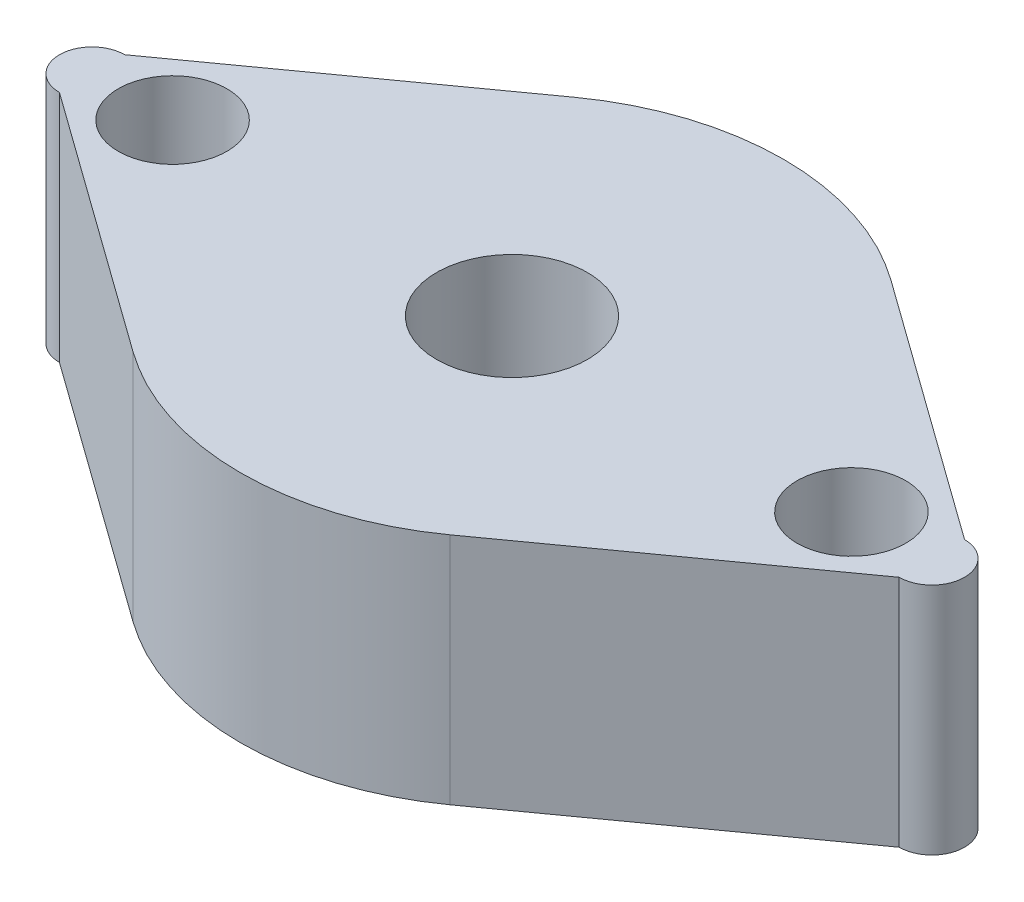
ISO-10303-21;
HEADER;
FILE_DESCRIPTION(('STEP AP214'),'2;1');
FILE_NAME('part.step','',(''),(''),'','','');
FILE_SCHEMA(('AUTOMOTIVE_DESIGN { 1 0 10303 214 1 1 1 1 }'));
ENDSEC;
DATA;
#1=APPLICATION_CONTEXT('core data for automotive mechanical design processes');
#2=APPLICATION_PROTOCOL_DEFINITION('international standard','automotive_design',2000,#1);
#3=PRODUCT_CONTEXT('',#1,'mechanical');
#4=PRODUCT('Part','Part','',(#3));
#5=PRODUCT_RELATED_PRODUCT_CATEGORY('part','',(#4));
#6=PRODUCT_DEFINITION_FORMATION('','',#4);
#7=PRODUCT_DEFINITION_CONTEXT('part definition',#1,'design');
#8=PRODUCT_DEFINITION('design','',#6,#7);
#9=PRODUCT_DEFINITION_SHAPE('','',#8);
#10=(LENGTH_UNIT() NAMED_UNIT(*) SI_UNIT(.MILLI.,.METRE.));
#11=(NAMED_UNIT(*) PLANE_ANGLE_UNIT() SI_UNIT($,.RADIAN.));
#12=(NAMED_UNIT(*) SI_UNIT($,.STERADIAN.) SOLID_ANGLE_UNIT());
#13=UNCERTAINTY_MEASURE_WITH_UNIT(LENGTH_MEASURE(1.E-05),#10,'distance_accuracy_value','');
#14=(GEOMETRIC_REPRESENTATION_CONTEXT(3) GLOBAL_UNCERTAINTY_ASSIGNED_CONTEXT((#13)) GLOBAL_UNIT_ASSIGNED_CONTEXT((#10,
#11,#12)) REPRESENTATION_CONTEXT('',''));
#15=CARTESIAN_POINT('',(0.,0.,0.));
#16=DIRECTION('',(0.,0.,1.));
#17=DIRECTION('',(1.,0.,0.));
#18=AXIS2_PLACEMENT_3D('',#15,#16,#17);
#19=CARTESIAN_POINT('',(27.8352326931538,15.5,0.));
#20=DIRECTION('',(0.,-1.,0.));
#21=DIRECTION('',(0.,0.,-1.));
#22=AXIS2_PLACEMENT_3D('',#19,#20,#21);
#23=CYLINDRICAL_SURFACE('',#22,2.16476730684618);
#24=CARTESIAN_POINT('',(27.8352326931538,0.,0.));
#25=DIRECTION('',(0.,1.,0.));
#26=DIRECTION('',(0.,0.,1.));
#27=AXIS2_PLACEMENT_3D('',#24,#25,#26);
#28=CIRCLE('',#27,2.16476730684618);
#29=CARTESIAN_POINT('',(27.8352326931538,0.,2.16476730684618));
#30=VERTEX_POINT('',#29);
#31=CARTESIAN_POINT('',(27.8352326931538,0.,-2.16476730684618));
#32=VERTEX_POINT('',#31);
#33=EDGE_CURVE('E159',#30,#32,#28,.T.);
#34=ORIENTED_EDGE('',*,*,#33,.T.);
#35=DIRECTION('',(0.,-1.,0.));
#36=VECTOR('',#35,1.);
#37=CARTESIAN_POINT('',(27.8352326931538,15.5,-2.16476730684618));
#38=LINE('',#37,#36);
#39=CARTESIAN_POINT('',(27.8352326931538,15.5,-2.16476730684618));
#40=VERTEX_POINT('',#39);
#41=EDGE_CURVE('E11',#40,#32,#38,.T.);
#42=ORIENTED_EDGE('',*,*,#41,.F.);
#43=CARTESIAN_POINT('',(27.8352326931538,15.5,0.));
#44=DIRECTION('',(0.,1.,0.));
#45=DIRECTION('',(0.,0.,1.));
#46=AXIS2_PLACEMENT_3D('',#43,#44,#45);
#47=CIRCLE('',#46,2.16476730684618);
#48=CARTESIAN_POINT('',(27.8352326931538,15.5,2.16476730684618));
#49=VERTEX_POINT('',#48);
#50=EDGE_CURVE('E194',#49,#40,#47,.T.);
#51=ORIENTED_EDGE('',*,*,#50,.F.);
#52=DIRECTION('',(0.,-1.,0.));
#53=VECTOR('',#52,1.);
#54=CARTESIAN_POINT('',(27.8352326931538,15.5,2.16476730684618));
#55=LINE('',#54,#53);
#56=EDGE_CURVE('E65',#49,#30,#55,.T.);
#57=ORIENTED_EDGE('',*,*,#56,.T.);
#58=EDGE_LOOP('',(#34,#42,#51,#57));
#59=FACE_BOUND('',#58,.T.);
#60=ADVANCED_FACE('F47',(#59),#23,.T.);
#61=CARTESIAN_POINT('',(10.5030724329478,15.5,-14.6179844530035));
#62=DIRECTION('',(-0.583504024052658,0.,0.812110247389082));
#63=DIRECTION('',(0.812110247389082,0.,0.583504024052658));
#64=AXIS2_PLACEMENT_3D('',#61,#62,#63);
#65=PLANE('',#64);
#66=DIRECTION('',(-0.812110247389082,0.,-0.583504024052658));
#67=VECTOR('',#66,1.);
#68=CARTESIAN_POINT('',(10.5030724329478,0.,-14.6179844530035));
#69=LINE('',#68,#67);
#70=CARTESIAN_POINT('',(10.5030724329478,0.,-14.6179844530035));
#71=VERTEX_POINT('',#70);
#72=EDGE_CURVE('E162',#32,#71,#69,.T.);
#73=ORIENTED_EDGE('',*,*,#72,.T.);
#74=DIRECTION('',(0.,-1.,0.));
#75=VECTOR('',#74,1.);
#76=CARTESIAN_POINT('',(10.5030724329478,15.5,-14.6179844530035));
#77=LINE('',#76,#75);
#78=CARTESIAN_POINT('',(10.5030724329478,15.5,-14.6179844530035));
#79=VERTEX_POINT('',#78);
#80=EDGE_CURVE('E57',#79,#71,#77,.T.);
#81=ORIENTED_EDGE('',*,*,#80,.F.);
#82=DIRECTION('',(-0.812110247389082,0.,-0.583504024052658));
#83=VECTOR('',#82,1.);
#84=CARTESIAN_POINT('',(10.5030724329478,15.5,-14.6179844530035));
#85=LINE('',#84,#83);
#86=EDGE_CURVE('E104',#40,#79,#85,.T.);
#87=ORIENTED_EDGE('',*,*,#86,.F.);
#88=ORIENTED_EDGE('',*,*,#41,.T.);
#89=EDGE_LOOP('',(#73,#81,#87,#88));
#90=FACE_BOUND('',#89,.T.);
#91=ADVANCED_FACE('F253',(#90),#65,.F.);
#92=CARTESIAN_POINT('',(0.,15.5,0.));
#93=DIRECTION('',(0.,-1.,0.));
#94=DIRECTION('',(0.,0.,-1.));
#95=AXIS2_PLACEMENT_3D('',#92,#93,#94);
#96=CYLINDRICAL_SURFACE('',#95,18.);
#97=CARTESIAN_POINT('',(0.,0.,0.));
#98=DIRECTION('',(0.,1.,0.));
#99=DIRECTION('',(0.,0.,1.));
#100=AXIS2_PLACEMENT_3D('',#97,#98,#99);
#101=CIRCLE('',#100,18.);
#102=CARTESIAN_POINT('',(-10.5030724329479,0.,-14.6179844530034));
#103=VERTEX_POINT('',#102);
#104=EDGE_CURVE('E165',#71,#103,#101,.T.);
#105=ORIENTED_EDGE('',*,*,#104,.T.);
#106=DIRECTION('',(0.,-1.,0.));
#107=VECTOR('',#106,1.);
#108=CARTESIAN_POINT('',(-10.5030724329479,15.5,-14.6179844530034));
#109=LINE('',#108,#107);
#110=CARTESIAN_POINT('',(-10.5030724329479,15.5,-14.6179844530034));
#111=VERTEX_POINT('',#110);
#112=EDGE_CURVE('E204',#111,#103,#109,.T.);
#113=ORIENTED_EDGE('',*,*,#112,.F.);
#114=CARTESIAN_POINT('',(0.,15.5,0.));
#115=DIRECTION('',(0.,1.,0.));
#116=DIRECTION('',(0.,0.,1.));
#117=AXIS2_PLACEMENT_3D('',#114,#115,#116);
#118=CIRCLE('',#117,18.);
#119=EDGE_CURVE('E214',#79,#111,#118,.T.);
#120=ORIENTED_EDGE('',*,*,#119,.F.);
#121=ORIENTED_EDGE('',*,*,#80,.T.);
#122=EDGE_LOOP('',(#105,#113,#120,#121));
#123=FACE_BOUND('',#122,.T.);
#124=ADVANCED_FACE('F212',(#123),#96,.T.);
#125=CARTESIAN_POINT('',(-10.5030724329479,15.5,-14.6179844530035));
#126=DIRECTION('',(-0.58350402405266,0.,-0.812110247389081));
#127=DIRECTION('',(-0.81211024738908,0.,0.583504024052659));
#128=AXIS2_PLACEMENT_3D('',#125,#126,#127);
#129=PLANE('',#128);
#130=DIRECTION('',(0.812110247389081,0.,-0.58350402405266));
#131=VECTOR('',#130,1.);
#132=CARTESIAN_POINT('',(-10.5030724329479,0.,-14.6179844530035));
#133=LINE('',#132,#131);
#134=CARTESIAN_POINT('',(-27.8352326931538,0.,-2.1647673068461));
#135=VERTEX_POINT('',#134);
#136=EDGE_CURVE('E169',#135,#103,#133,.T.);
#137=ORIENTED_EDGE('',*,*,#136,.F.);
#138=DIRECTION('',(0.,-1.,0.));
#139=VECTOR('',#138,1.);
#140=CARTESIAN_POINT('',(-27.8352326931538,15.5,-2.1647673068461));
#141=LINE('',#140,#139);
#142=CARTESIAN_POINT('',(-27.8352326931538,15.5,-2.1647673068461));
#143=VERTEX_POINT('',#142);
#144=EDGE_CURVE('E201',#143,#135,#141,.T.);
#145=ORIENTED_EDGE('',*,*,#144,.F.);
#146=DIRECTION('',(0.812110247389081,0.,-0.58350402405266));
#147=VECTOR('',#146,1.);
#148=CARTESIAN_POINT('',(-10.5030724329479,15.5,-14.6179844530035));
#149=LINE('',#148,#147);
#150=EDGE_CURVE('E223',#143,#111,#149,.T.);
#151=ORIENTED_EDGE('',*,*,#150,.T.);
#152=ORIENTED_EDGE('',*,*,#112,.T.);
#153=EDGE_LOOP('',(#137,#145,#151,#152));
#154=FACE_BOUND('',#153,.T.);
#155=ADVANCED_FACE('F221',(#154),#129,.T.);
#156=CARTESIAN_POINT('',(-27.8352326931538,15.5,2.22044604925031E-13));
#157=DIRECTION('',(0.,-1.,0.));
#158=DIRECTION('',(0.,0.,-1.));
#159=AXIS2_PLACEMENT_3D('',#156,#157,#158);
#160=CYLINDRICAL_SURFACE('',#159,2.16476730684624);
#161=CARTESIAN_POINT('',(-27.8352326931538,0.,2.22044604925031E-13));
#162=DIRECTION('',(0.,1.,0.));
#163=DIRECTION('',(0.,0.,1.));
#164=AXIS2_PLACEMENT_3D('',#161,#162,#163);
#165=CIRCLE('',#164,2.16476730684624);
#166=CARTESIAN_POINT('',(-27.8352326931538,0.,2.16476730684643));
#167=VERTEX_POINT('',#166);
#168=EDGE_CURVE('E173',#167,#135,#165,.F.);
#169=ORIENTED_EDGE('',*,*,#168,.F.);
#170=DIRECTION('',(0.,-1.,0.));
#171=VECTOR('',#170,1.);
#172=CARTESIAN_POINT('',(-27.8352326931538,15.5,2.16476730684643));
#173=LINE('',#172,#171);
#174=CARTESIAN_POINT('',(-27.8352326931538,15.5,2.16476730684643));
#175=VERTEX_POINT('',#174);
#176=EDGE_CURVE('E141',#175,#167,#173,.T.);
#177=ORIENTED_EDGE('',*,*,#176,.F.);
#178=CARTESIAN_POINT('',(-27.8352326931538,15.5,2.22044604925031E-13));
#179=DIRECTION('',(0.,1.,0.));
#180=DIRECTION('',(0.,0.,1.));
#181=AXIS2_PLACEMENT_3D('',#178,#179,#180);
#182=CIRCLE('',#181,2.16476730684624);
#183=EDGE_CURVE('E129',#175,#143,#182,.F.);
#184=ORIENTED_EDGE('',*,*,#183,.T.);
#185=ORIENTED_EDGE('',*,*,#144,.T.);
#186=EDGE_LOOP('',(#169,#177,#184,#185));
#187=FACE_BOUND('',#186,.T.);
#188=ADVANCED_FACE('F276',(#187),#160,.T.);
#189=CARTESIAN_POINT('',(-10.5030724329476,15.5,14.6179844530035));
#190=DIRECTION('',(0.583504024052649,0.,-0.812110247389088));
#191=DIRECTION('',(-0.812110247389088,0.,-0.583504024052649));
#192=AXIS2_PLACEMENT_3D('',#189,#190,#191);
#193=PLANE('',#192);
#194=DIRECTION('',(0.812110247389088,0.,0.583504024052649));
#195=VECTOR('',#194,1.);
#196=CARTESIAN_POINT('',(-10.5030724329476,0.,14.6179844530035));
#197=LINE('',#196,#195);
#198=CARTESIAN_POINT('',(-10.5030724329478,0.,14.6179844530035));
#199=VERTEX_POINT('',#198);
#200=EDGE_CURVE('E137',#167,#199,#197,.T.);
#201=ORIENTED_EDGE('',*,*,#200,.T.);
#202=DIRECTION('',(0.,-1.,0.));
#203=VECTOR('',#202,1.);
#204=CARTESIAN_POINT('',(-10.5030724329478,15.5,14.6179844530035));
#205=LINE('',#204,#203);
#206=CARTESIAN_POINT('',(-10.5030724329478,15.5,14.6179844530035));
#207=VERTEX_POINT('',#206);
#208=EDGE_CURVE('E134',#207,#199,#205,.T.);
#209=ORIENTED_EDGE('',*,*,#208,.F.);
#210=DIRECTION('',(0.812110247389088,0.,0.583504024052649));
#211=VECTOR('',#210,1.);
#212=CARTESIAN_POINT('',(-10.5030724329476,15.5,14.6179844530035));
#213=LINE('',#212,#211);
#214=EDGE_CURVE('E120',#175,#207,#213,.T.);
#215=ORIENTED_EDGE('',*,*,#214,.F.);
#216=ORIENTED_EDGE('',*,*,#176,.T.);
#217=EDGE_LOOP('',(#201,#209,#215,#216));
#218=FACE_BOUND('',#217,.T.);
#219=ADVANCED_FACE('F135',(#218),#193,.F.);
#220=CARTESIAN_POINT('',(0.,15.5,0.));
#221=DIRECTION('',(0.,-1.,0.));
#222=DIRECTION('',(0.,0.,-1.));
#223=AXIS2_PLACEMENT_3D('',#220,#221,#222);
#224=CYLINDRICAL_SURFACE('',#223,18.);
#225=CARTESIAN_POINT('',(0.,0.,0.));
#226=DIRECTION('',(0.,1.,0.));
#227=DIRECTION('',(0.,0.,1.));
#228=AXIS2_PLACEMENT_3D('',#225,#226,#227);
#229=CIRCLE('',#228,18.);
#230=CARTESIAN_POINT('',(10.5030724329478,0.,14.6179844530035));
#231=VERTEX_POINT('',#230);
#232=EDGE_CURVE('E179',#199,#231,#229,.T.);
#233=ORIENTED_EDGE('',*,*,#232,.T.);
#234=DIRECTION('',(0.,-1.,0.));
#235=VECTOR('',#234,1.);
#236=CARTESIAN_POINT('',(10.5030724329478,15.5,14.6179844530035));
#237=LINE('',#236,#235);
#238=CARTESIAN_POINT('',(10.5030724329478,15.5,14.6179844530035));
#239=VERTEX_POINT('',#238);
#240=EDGE_CURVE('E92',#239,#231,#237,.T.);
#241=ORIENTED_EDGE('',*,*,#240,.F.);
#242=CARTESIAN_POINT('',(0.,15.5,0.));
#243=DIRECTION('',(0.,1.,0.));
#244=DIRECTION('',(0.,0.,1.));
#245=AXIS2_PLACEMENT_3D('',#242,#243,#244);
#246=CIRCLE('',#245,18.);
#247=EDGE_CURVE('E126',#207,#239,#246,.T.);
#248=ORIENTED_EDGE('',*,*,#247,.F.);
#249=ORIENTED_EDGE('',*,*,#208,.T.);
#250=EDGE_LOOP('',(#233,#241,#248,#249));
#251=FACE_BOUND('',#250,.T.);
#252=ADVANCED_FACE('F143',(#251),#224,.T.);
#253=CARTESIAN_POINT('',(22.5,15.5,0.));
#254=DIRECTION('',(0.,-1.,0.));
#255=DIRECTION('',(0.,0.,-1.));
#256=AXIS2_PLACEMENT_3D('',#253,#254,#255);
#257=CYLINDRICAL_SURFACE('',#256,3.6);
#258=CARTESIAN_POINT('',(22.5,15.5,0.));
#259=DIRECTION('',(0.,1.,0.));
#260=DIRECTION('',(0.,0.,1.));
#261=AXIS2_PLACEMENT_3D('',#258,#259,#260);
#262=CIRCLE('',#261,3.6);
#263=CARTESIAN_POINT('',(22.5,15.5,3.6));
#264=VERTEX_POINT('',#263);
#265=EDGE_CURVE('E148',#264,#264,#262,.T.);
#266=ORIENTED_EDGE('',*,*,#265,.T.);
#267=EDGE_LOOP('',(#266));
#268=FACE_BOUND('',#267,.T.);
#269=CARTESIAN_POINT('',(22.5,0.,0.));
#270=DIRECTION('',(0.,1.,0.));
#271=DIRECTION('',(0.,0.,1.));
#272=AXIS2_PLACEMENT_3D('',#269,#270,#271);
#273=CIRCLE('',#272,3.6);
#274=CARTESIAN_POINT('',(22.5,0.,3.6));
#275=VERTEX_POINT('',#274);
#276=EDGE_CURVE('E186',#275,#275,#273,.T.);
#277=ORIENTED_EDGE('',*,*,#276,.F.);
#278=EDGE_LOOP('',(#277));
#279=FACE_BOUND('',#278,.T.);
#280=ADVANCED_FACE('F261',(#268,#279),#257,.F.);
#281=CARTESIAN_POINT('',(10.5030724329478,15.5,14.6179844530035));
#282=DIRECTION('',(0.583504024052658,0.,0.812110247389082));
#283=DIRECTION('',(0.812110247389082,0.,-0.583504024052658));
#284=AXIS2_PLACEMENT_3D('',#281,#282,#283);
#285=PLANE('',#284);
#286=DIRECTION('',(-0.812110247389082,0.,0.583504024052658));
#287=VECTOR('',#286,1.);
#288=CARTESIAN_POINT('',(10.5030724329478,0.,14.6179844530035));
#289=LINE('',#288,#287);
#290=EDGE_CURVE('E182',#30,#231,#289,.T.);
#291=ORIENTED_EDGE('',*,*,#290,.F.);
#292=ORIENTED_EDGE('',*,*,#56,.F.);
#293=DIRECTION('',(-0.812110247389082,0.,0.583504024052658));
#294=VECTOR('',#293,1.);
#295=CARTESIAN_POINT('',(10.5030724329478,15.5,14.6179844530035));
#296=LINE('',#295,#294);
#297=EDGE_CURVE('E145',#49,#239,#296,.T.);
#298=ORIENTED_EDGE('',*,*,#297,.T.);
#299=ORIENTED_EDGE('',*,*,#240,.T.);
#300=EDGE_LOOP('',(#291,#292,#298,#299));
#301=FACE_BOUND('',#300,.T.);
#302=ADVANCED_FACE('F258',(#301),#285,.T.);
#303=CARTESIAN_POINT('',(-22.5,15.5,2.22044604925031E-13));
#304=DIRECTION('',(0.,-1.,0.));
#305=DIRECTION('',(0.,0.,-1.));
#306=AXIS2_PLACEMENT_3D('',#303,#304,#305);
#307=CYLINDRICAL_SURFACE('',#306,3.60000000000007);
#308=CARTESIAN_POINT('',(-22.5,15.5,2.22044604925031E-13));
#309=DIRECTION('',(0.,1.,0.));
#310=DIRECTION('',(0.,0.,1.));
#311=AXIS2_PLACEMENT_3D('',#308,#309,#310);
#312=CIRCLE('',#311,3.60000000000007);
#313=CARTESIAN_POINT('',(-22.5,15.5,3.60000000000029));
#314=VERTEX_POINT('',#313);
#315=EDGE_CURVE('E155',#314,#314,#312,.F.);
#316=ORIENTED_EDGE('',*,*,#315,.F.);
#317=EDGE_LOOP('',(#316));
#318=FACE_BOUND('',#317,.T.);
#319=CARTESIAN_POINT('',(-22.5,0.,2.22044604925031E-13));
#320=DIRECTION('',(0.,1.,0.));
#321=DIRECTION('',(0.,0.,1.));
#322=AXIS2_PLACEMENT_3D('',#319,#320,#321);
#323=CIRCLE('',#322,3.60000000000007);
#324=CARTESIAN_POINT('',(-22.5,0.,3.60000000000029));
#325=VERTEX_POINT('',#324);
#326=EDGE_CURVE('E190',#325,#325,#323,.F.);
#327=ORIENTED_EDGE('',*,*,#326,.T.);
#328=EDGE_LOOP('',(#327));
#329=FACE_BOUND('',#328,.T.);
#330=ADVANCED_FACE('F260',(#318,#329),#307,.F.);
#331=CARTESIAN_POINT('',(0.,15.5,0.));
#332=DIRECTION('',(0.,1.,0.));
#333=DIRECTION('',(0.,0.,1.));
#334=AXIS2_PLACEMENT_3D('',#331,#332,#333);
#335=PLANE('',#334);
#336=CARTESIAN_POINT('',(0.,15.5,0.));
#337=DIRECTION('',(0.,1.,0.));
#338=DIRECTION('',(0.,0.,1.));
#339=AXIS2_PLACEMENT_3D('',#336,#337,#338);
#340=CIRCLE('',#339,5.);
#341=CARTESIAN_POINT('',(0.,15.5,5.));
#342=VERTEX_POINT('',#341);
#343=EDGE_CURVE('E234',#342,#342,#340,.T.);
#344=ORIENTED_EDGE('',*,*,#343,.F.);
#345=EDGE_LOOP('',(#344));
#346=FACE_BOUND('',#345,.T.);
#347=ORIENTED_EDGE('',*,*,#50,.T.);
#348=ORIENTED_EDGE('',*,*,#86,.T.);
#349=ORIENTED_EDGE('',*,*,#119,.T.);
#350=ORIENTED_EDGE('',*,*,#150,.F.);
#351=ORIENTED_EDGE('',*,*,#183,.F.);
#352=ORIENTED_EDGE('',*,*,#214,.T.);
#353=ORIENTED_EDGE('',*,*,#247,.T.);
#354=ORIENTED_EDGE('',*,*,#297,.F.);
#355=EDGE_LOOP('',(#347,#348,#349,#350,#351,#352,#353,#354));
#356=FACE_BOUND('',#355,.T.);
#357=ORIENTED_EDGE('',*,*,#265,.F.);
#358=EDGE_LOOP('',(#357));
#359=FACE_BOUND('',#358,.T.);
#360=ORIENTED_EDGE('',*,*,#315,.T.);
#361=EDGE_LOOP('',(#360));
#362=FACE_BOUND('',#361,.T.);
#363=ADVANCED_FACE('F122',(#346,#356,#359,#362),#335,.T.);
#364=CARTESIAN_POINT('',(0.,0.,0.));
#365=DIRECTION('',(0.,1.,0.));
#366=DIRECTION('',(0.,0.,1.));
#367=AXIS2_PLACEMENT_3D('',#364,#365,#366);
#368=PLANE('',#367);
#369=CARTESIAN_POINT('',(0.,0.,0.));
#370=DIRECTION('',(0.,1.,0.));
#371=DIRECTION('',(0.,0.,1.));
#372=AXIS2_PLACEMENT_3D('',#369,#370,#371);
#373=CIRCLE('',#372,5.);
#374=CARTESIAN_POINT('',(0.,0.,5.));
#375=VERTEX_POINT('',#374);
#376=EDGE_CURVE('E50',#375,#375,#373,.T.);
#377=ORIENTED_EDGE('',*,*,#376,.T.);
#378=EDGE_LOOP('',(#377));
#379=FACE_BOUND('',#378,.T.);
#380=ORIENTED_EDGE('',*,*,#33,.F.);
#381=ORIENTED_EDGE('',*,*,#290,.T.);
#382=ORIENTED_EDGE('',*,*,#232,.F.);
#383=ORIENTED_EDGE('',*,*,#200,.F.);
#384=ORIENTED_EDGE('',*,*,#168,.T.);
#385=ORIENTED_EDGE('',*,*,#136,.T.);
#386=ORIENTED_EDGE('',*,*,#104,.F.);
#387=ORIENTED_EDGE('',*,*,#72,.F.);
#388=EDGE_LOOP('',(#380,#381,#382,#383,#384,#385,#386,#387));
#389=FACE_BOUND('',#388,.T.);
#390=ORIENTED_EDGE('',*,*,#276,.T.);
#391=EDGE_LOOP('',(#390));
#392=FACE_BOUND('',#391,.T.);
#393=ORIENTED_EDGE('',*,*,#326,.F.);
#394=EDGE_LOOP('',(#393));
#395=FACE_BOUND('',#394,.T.);
#396=ADVANCED_FACE('F216',(#379,#389,#392,#395),#368,.F.);
#397=CARTESIAN_POINT('',(0.,-16.,0.));
#398=DIRECTION('',(0.,1.,0.));
#399=DIRECTION('',(0.,0.,1.));
#400=AXIS2_PLACEMENT_3D('',#397,#398,#399);
#401=CYLINDRICAL_SURFACE('',#400,5.);
#402=ORIENTED_EDGE('',*,*,#343,.T.);
#403=EDGE_LOOP('',(#402));
#404=FACE_BOUND('',#403,.T.);
#405=ORIENTED_EDGE('',*,*,#376,.F.);
#406=EDGE_LOOP('',(#405));
#407=FACE_BOUND('',#406,.T.);
#408=ADVANCED_FACE('F244',(#404,#407),#401,.F.);
#409=CLOSED_SHELL('',(#60,#91,#124,#155,#188,#219,#252,#280,#302,#330,#363,#396,#408));
#410=MANIFOLD_SOLID_BREP('B2',#409);
#411=ADVANCED_BREP_SHAPE_REPRESENTATION('',(#18,#410),#14);
#412=SHAPE_DEFINITION_REPRESENTATION(#9,#411);
ENDSEC;
END-ISO-10303-21;
